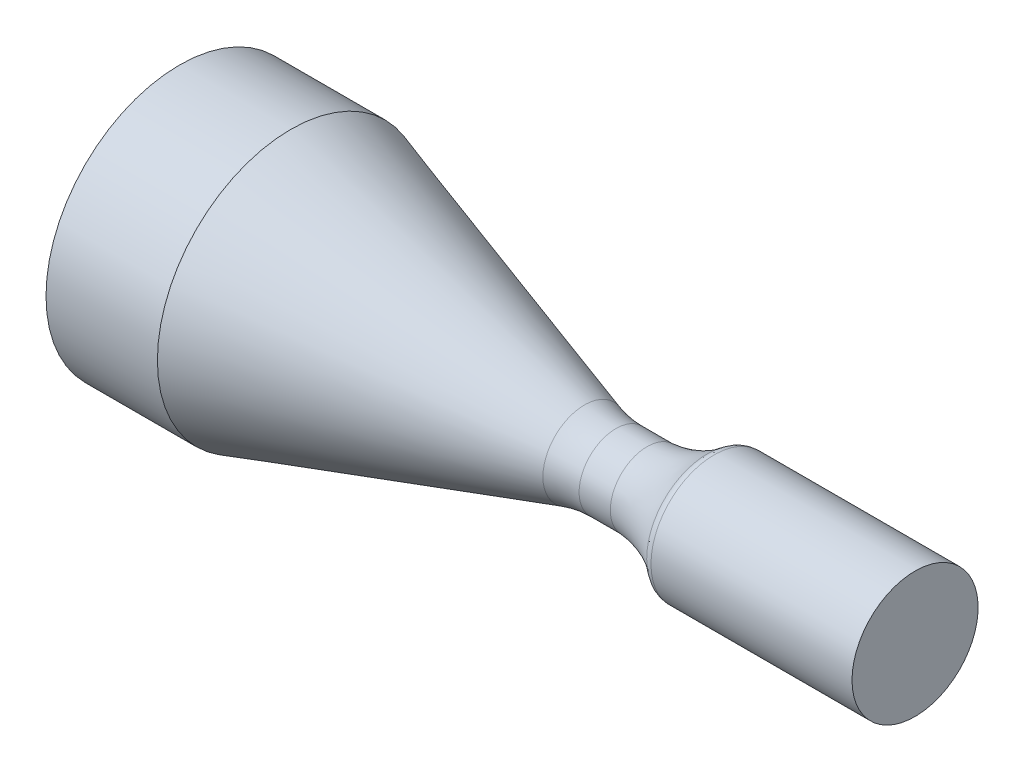
ISO-10303-21;
HEADER;
FILE_DESCRIPTION(('STEP AP214'),'2;1');
FILE_NAME('part.step','',(''),(''),'','','');
FILE_SCHEMA(('AUTOMOTIVE_DESIGN { 1 0 10303 214 1 1 1 1 }'));
ENDSEC;
DATA;
#1=APPLICATION_CONTEXT('core data for automotive mechanical design processes');
#2=APPLICATION_PROTOCOL_DEFINITION('international standard','automotive_design',2000,#1);
#3=PRODUCT_CONTEXT('',#1,'mechanical');
#4=PRODUCT('Part','Part','',(#3));
#5=PRODUCT_RELATED_PRODUCT_CATEGORY('part','',(#4));
#6=PRODUCT_DEFINITION_FORMATION('','',#4);
#7=PRODUCT_DEFINITION_CONTEXT('part definition',#1,'design');
#8=PRODUCT_DEFINITION('design','',#6,#7);
#9=PRODUCT_DEFINITION_SHAPE('','',#8);
#10=(LENGTH_UNIT() NAMED_UNIT(*) SI_UNIT(.MILLI.,.METRE.));
#11=(NAMED_UNIT(*) PLANE_ANGLE_UNIT() SI_UNIT($,.RADIAN.));
#12=(NAMED_UNIT(*) SI_UNIT($,.STERADIAN.) SOLID_ANGLE_UNIT());
#13=UNCERTAINTY_MEASURE_WITH_UNIT(LENGTH_MEASURE(1.E-05),#10,'distance_accuracy_value','');
#14=(GEOMETRIC_REPRESENTATION_CONTEXT(3) GLOBAL_UNCERTAINTY_ASSIGNED_CONTEXT((#13)) GLOBAL_UNIT_ASSIGNED_CONTEXT((#10,
#11,#12)) REPRESENTATION_CONTEXT('',''));
#15=CARTESIAN_POINT('',(0.,0.,0.));
#16=DIRECTION('',(0.,0.,1.));
#17=DIRECTION('',(1.,0.,0.));
#18=AXIS2_PLACEMENT_3D('',#15,#16,#17);
#19=CARTESIAN_POINT('',(200.,0.,0.));
#20=DIRECTION('',(1.,0.,0.));
#21=DIRECTION('',(0.,0.,-1.));
#22=AXIS2_PLACEMENT_3D('',#19,#20,#21);
#23=PLANE('',#22);
#24=CARTESIAN_POINT('',(200.,0.,0.));
#25=DIRECTION('',(-1.,0.,0.));
#26=DIRECTION('',(0.,0.,1.));
#27=AXIS2_PLACEMENT_3D('',#24,#25,#26);
#28=CIRCLE('',#27,127.);
#29=CARTESIAN_POINT('',(200.,0.,127.));
#30=VERTEX_POINT('',#29);
#31=EDGE_CURVE('E10',#30,#30,#28,.T.);
#32=ORIENTED_EDGE('',*,*,#31,.T.);
#33=EDGE_LOOP('',(#32));
#34=FACE_BOUND('',#33,.T.);
#35=ADVANCED_FACE('F32',(#34),#23,.F.);
#36=CARTESIAN_POINT('',(0.,0.,0.));
#37=DIRECTION('',(-1.,0.,0.));
#38=DIRECTION('',(0.,0.,1.));
#39=AXIS2_PLACEMENT_3D('',#36,#37,#38);
#40=CYLINDRICAL_SURFACE('',#39,127.);
#41=ORIENTED_EDGE('',*,*,#31,.F.);
#42=EDGE_LOOP('',(#41));
#43=FACE_BOUND('',#42,.T.);
#44=CARTESIAN_POINT('',(306.,0.,0.));
#45=DIRECTION('',(-1.,0.,0.));
#46=DIRECTION('',(0.,0.,1.));
#47=AXIS2_PLACEMENT_3D('',#44,#45,#46);
#48=CIRCLE('',#47,127.);
#49=CARTESIAN_POINT('',(306.,0.,127.));
#50=VERTEX_POINT('',#49);
#51=EDGE_CURVE('E38',#50,#50,#48,.T.);
#52=ORIENTED_EDGE('',*,*,#51,.T.);
#53=EDGE_LOOP('',(#52));
#54=FACE_BOUND('',#53,.T.);
#55=ADVANCED_FACE('F76',(#43,#54),#40,.T.);
#56=CARTESIAN_POINT('',(585.416444946528,0.,0.));
#57=DIRECTION('',(-1.,0.,0.));
#58=DIRECTION('',(0.,0.,1.));
#59=AXIS2_PLACEMENT_3D('',#56,#57,#58);
#60=CONICAL_SURFACE('',#59,39.5635614453042,0.303272165024855);
#61=CARTESIAN_POINT('',(585.416444946528,0.,0.));
#62=DIRECTION('',(-1.,0.,0.));
#63=DIRECTION('',(0.,0.,1.));
#64=AXIS2_PLACEMENT_3D('',#61,#62,#63);
#65=CIRCLE('',#64,39.5635614453042);
#66=CARTESIAN_POINT('',(585.416444946528,0.,39.5635614453042));
#67=VERTEX_POINT('',#66);
#68=EDGE_CURVE('E42',#67,#67,#65,.T.);
#69=CARTESIAN_POINT('',(306.,0.,127.));
#70=CARTESIAN_POINT('',(308.910587968193,0.,126.089203765055));
#71=CARTESIAN_POINT('',(311.821175936386,0.,125.17840753011));
#72=CARTESIAN_POINT('',(317.642351872772,0.,123.356815060221));
#73=CARTESIAN_POINT('',(320.552939840965,0.,122.446018825276));
#74=CARTESIAN_POINT('',(326.374115777351,0.,120.624426355387));
#75=CARTESIAN_POINT('',(329.284703745544,0.,119.713630120442));
#76=CARTESIAN_POINT('',(335.10587968193,0.,117.892037650553));
#77=CARTESIAN_POINT('',(338.016467650123,0.,116.981241415608));
#78=CARTESIAN_POINT('',(343.837643586509,0.,115.159648945718));
#79=CARTESIAN_POINT('',(346.748231554702,0.,114.248852710774));
#80=CARTESIAN_POINT('',(352.569407491088,0.,112.427260240884));
#81=CARTESIAN_POINT('',(355.479995459281,0.,111.516464005939));
#82=CARTESIAN_POINT('',(361.301171395667,0.,109.69487153605));
#83=CARTESIAN_POINT('',(364.21175936386,0.,108.784075301105));
#84=CARTESIAN_POINT('',(370.032935300246,0.,106.962482831216));
#85=CARTESIAN_POINT('',(372.943523268439,0.,106.051686596271));
#86=CARTESIAN_POINT('',(378.764699204825,0.,104.230094126381));
#87=CARTESIAN_POINT('',(381.675287173018,0.,103.319297891437));
#88=CARTESIAN_POINT('',(387.496463109404,0.,101.497705421547));
#89=CARTESIAN_POINT('',(390.407051077597,0.,100.586909186602));
#90=CARTESIAN_POINT('',(396.228227013983,0.,98.7653167167128));
#91=CARTESIAN_POINT('',(399.138814982176,0.,97.854520481768));
#92=CARTESIAN_POINT('',(404.959990918562,0.,96.0329280118785));
#93=CARTESIAN_POINT('',(407.870578886755,0.,95.1221317769338));
#94=CARTESIAN_POINT('',(413.691754823141,0.,93.3005393070443));
#95=CARTESIAN_POINT('',(416.602342791334,0.,92.3897430720996));
#96=CARTESIAN_POINT('',(422.42351872772,0.,90.5681506022101));
#97=CARTESIAN_POINT('',(425.334106695913,0.,89.6573543672653));
#98=CARTESIAN_POINT('',(431.155282632299,0.,87.8357618973758));
#99=CARTESIAN_POINT('',(434.065870600492,0.,86.9249656624311));
#100=CARTESIAN_POINT('',(439.887046536878,0.,85.1033731925416));
#101=CARTESIAN_POINT('',(442.797634505071,0.,84.1925769575968));
#102=CARTESIAN_POINT('',(448.618810441457,0.,82.3709844877073));
#103=CARTESIAN_POINT('',(451.52939840965,0.,81.4601882527626));
#104=CARTESIAN_POINT('',(457.350574346036,0.,79.6385957828731));
#105=CARTESIAN_POINT('',(460.261162314229,0.,78.7277995479283));
#106=CARTESIAN_POINT('',(466.082338250615,0.,76.9062070780388));
#107=CARTESIAN_POINT('',(468.992926218808,0.,75.9954108430941));
#108=CARTESIAN_POINT('',(474.814102155194,0.,74.1738183732046));
#109=CARTESIAN_POINT('',(477.724690123387,0.,73.2630221382599));
#110=CARTESIAN_POINT('',(483.545866059773,0.,71.4414296683704));
#111=CARTESIAN_POINT('',(486.456454027966,0.,70.5306334334256));
#112=CARTESIAN_POINT('',(492.277629964352,0.,68.7090409635361));
#113=CARTESIAN_POINT('',(495.188217932545,0.,67.7982447285914));
#114=CARTESIAN_POINT('',(501.009393868931,0.,65.9766522587019));
#115=CARTESIAN_POINT('',(503.919981837124,0.,65.0658560237571));
#116=CARTESIAN_POINT('',(509.74115777351,0.,63.2442635538676));
#117=CARTESIAN_POINT('',(512.651745741703,0.,62.3334673189229));
#118=CARTESIAN_POINT('',(518.472921678089,0.,60.5118748490334));
#119=CARTESIAN_POINT('',(521.383509646282,0.,59.6010786140886));
#120=CARTESIAN_POINT('',(527.204685582668,0.,57.7794861441991));
#121=CARTESIAN_POINT('',(530.115273550861,0.,56.8686899092544));
#122=CARTESIAN_POINT('',(535.936449487247,0.,55.0470974393649));
#123=CARTESIAN_POINT('',(538.84703745544,0.,54.1363012044202));
#124=CARTESIAN_POINT('',(544.668213391826,0.,52.3147087345307));
#125=CARTESIAN_POINT('',(547.578801360019,0.,51.4039124995859));
#126=CARTESIAN_POINT('',(553.399977296405,0.,49.5823200296964));
#127=CARTESIAN_POINT('',(556.310565264598,0.,48.6715237947517));
#128=CARTESIAN_POINT('',(562.131741200984,0.,46.8499313248622));
#129=CARTESIAN_POINT('',(565.042329169177,0.,45.9391350899174));
#130=CARTESIAN_POINT('',(570.863505105563,0.,44.1175426200279));
#131=CARTESIAN_POINT('',(573.774093073756,0.,43.2067463850832));
#132=CARTESIAN_POINT('',(579.595269010142,0.,41.3851539151937));
#133=CARTESIAN_POINT('',(582.505856978335,0.,40.4743576802489));
#134=CARTESIAN_POINT('',(585.416444946528,0.,39.5635614453042));
#135=B_SPLINE_CURVE_WITH_KNOTS('',3,(#69,#70,#71,#72,#73,#74,#75,#76,#77,#78,#79,#80,#81,#82,
#83,#84,#85,#86,#87,#88,#89,#90,#91,#92,#93,#94,#95,#96,#97,#98,#99,#100,#101,#102,#103,#104,
#105,#106,#107,#108,#109,#110,#111,#112,#113,#114,#115,#116,#117,#118,#119,#120,#121,#122,#123,
#124,#125,#126,#127,#128,#129,#130,#131,#132,#133,#134),.UNSPECIFIED.,.F.,.F.,(4,2,2,2,2,2,2,2,
2,2,2,2,2,2,2,2,2,2,2,2,2,2,2,2,2,2,2,2,2,2,2,2,4),(0.,9.14929772822012,18.2985954564403,
27.4478931846604,36.5971909128806,45.7464886411007,54.8957863693209,64.045084097541,
73.1943818257612,82.3436795539813,91.4929772822015,100.642275010422,109.791572738642,
118.940870466862,128.090168195082,137.239465923302,146.388763651522,155.538061379742,
164.687359107963,173.836656836183,182.985954564403,192.135252292623,201.284550020843,
210.433847749063,219.583145477284,228.732443205504,237.881740933724,247.031038661944,
256.180336390164,265.329634118384,274.478931846604,283.628229574825,292.777527303045),.UNSPECIFIED.);
#136=EDGE_CURVE('BSEAM80',#50,#67,#135,.T.);
#137=ORIENTED_EDGE('',*,*,#51,.F.);
#138=ORIENTED_EDGE('',*,*,#68,.T.);
#139=ORIENTED_EDGE('',*,*,#136,.T.);
#140=ORIENTED_EDGE('',*,*,#136,.F.);
#141=EDGE_LOOP('',(#137,#139,#138,#140));
#142=FACE_BOUND('',#141,.T.);
#143=ADVANCED_FACE('F80',(#142),#60,.T.);
#144=CARTESIAN_POINT('',(615.280908711943,0.,0.));
#145=DIRECTION('',(-1.,0.,0.));
#146=DIRECTION('',(0.,0.,1.));
#147=AXIS2_PLACEMENT_3D('',#144,#145,#146);
#148=TOROIDAL_SURFACE('',#147,135.,100.);
#149=ORIENTED_EDGE('',*,*,#68,.F.);
#150=EDGE_LOOP('',(#149));
#151=FACE_BOUND('',#150,.T.);
#152=CARTESIAN_POINT('',(615.280908711943,0.,0.));
#153=DIRECTION('',(-1.,0.,0.));
#154=DIRECTION('',(0.,0.,1.));
#155=AXIS2_PLACEMENT_3D('',#152,#153,#154);
#156=CIRCLE('',#155,35.);
#157=CARTESIAN_POINT('',(615.280908711943,0.,35.));
#158=VERTEX_POINT('',#157);
#159=EDGE_CURVE('E46',#158,#158,#156,.T.);
#160=ORIENTED_EDGE('',*,*,#159,.T.);
#161=EDGE_LOOP('',(#160));
#162=FACE_BOUND('',#161,.T.);
#163=ADVANCED_FACE('F85',(#151,#162),#148,.F.);
#164=CARTESIAN_POINT('',(0.,0.,0.));
#165=DIRECTION('',(-1.,0.,0.));
#166=DIRECTION('',(0.,0.,1.));
#167=AXIS2_PLACEMENT_3D('',#164,#165,#166);
#168=CYLINDRICAL_SURFACE('',#167,35.);
#169=ORIENTED_EDGE('',*,*,#159,.F.);
#170=EDGE_LOOP('',(#169));
#171=FACE_BOUND('',#170,.T.);
#172=CARTESIAN_POINT('',(645.,0.,0.));
#173=DIRECTION('',(-1.,0.,0.));
#174=DIRECTION('',(0.,0.,1.));
#175=AXIS2_PLACEMENT_3D('',#172,#173,#174);
#176=CIRCLE('',#175,35.);
#177=CARTESIAN_POINT('',(645.,0.,35.));
#178=VERTEX_POINT('',#177);
#179=EDGE_CURVE('E51',#178,#178,#176,.T.);
#180=ORIENTED_EDGE('',*,*,#179,.T.);
#181=EDGE_LOOP('',(#180));
#182=FACE_BOUND('',#181,.T.);
#183=ADVANCED_FACE('F91',(#171,#182),#168,.T.);
#184=CARTESIAN_POINT('',(638.626384001197,0.,0.));
#185=DIRECTION('',(-1.,0.,0.));
#186=DIRECTION('',(0.,0.,1.));
#187=AXIS2_PLACEMENT_3D('',#184,#185,#186);
#188=TOROIDAL_SURFACE('',#187,134.796678397128,99.9999999999999);
#189=ORIENTED_EDGE('',*,*,#179,.F.);
#190=EDGE_LOOP('',(#189));
#191=FACE_BOUND('',#190,.T.);
#192=CARTESIAN_POINT('',(702.324557443191,0.,0.));
#193=DIRECTION('',(-1.,0.,0.));
#194=DIRECTION('',(0.,0.,1.));
#195=AXIS2_PLACEMENT_3D('',#192,#193,#194);
#196=CIRCLE('',#195,57.7087889451934);
#197=CARTESIAN_POINT('',(702.324557443191,0.,57.7087889451934));
#198=VERTEX_POINT('',#197);
#199=EDGE_CURVE('E54',#198,#198,#196,.T.);
#200=ORIENTED_EDGE('',*,*,#199,.T.);
#201=EDGE_LOOP('',(#200));
#202=FACE_BOUND('',#201,.T.);
#203=ADVANCED_FACE('F95',(#191,#202),#188,.F.);
#204=CARTESIAN_POINT('',(708.69437478739,0.,0.));
#205=DIRECTION('',(-1.,0.,0.));
#206=DIRECTION('',(0.,0.,1.));
#207=AXIS2_PLACEMENT_3D('',#204,#205,#206);
#208=TOROIDAL_SURFACE('',#207,50.,9.99999999999999);
#209=ORIENTED_EDGE('',*,*,#199,.F.);
#210=EDGE_LOOP('',(#209));
#211=FACE_BOUND('',#210,.T.);
#212=CARTESIAN_POINT('',(708.69437478739,0.,0.));
#213=DIRECTION('',(-1.,0.,0.));
#214=DIRECTION('',(0.,0.,1.));
#215=AXIS2_PLACEMENT_3D('',#212,#213,#214);
#216=CIRCLE('',#215,60.);
#217=CARTESIAN_POINT('',(708.69437478739,0.,60.));
#218=VERTEX_POINT('',#217);
#219=EDGE_CURVE('E57',#218,#218,#216,.T.);
#220=ORIENTED_EDGE('',*,*,#219,.T.);
#221=EDGE_LOOP('',(#220));
#222=FACE_BOUND('',#221,.T.);
#223=ADVANCED_FACE('F72',(#211,#222),#208,.T.);
#224=CARTESIAN_POINT('',(0.,0.,0.));
#225=DIRECTION('',(-1.,0.,0.));
#226=DIRECTION('',(0.,0.,1.));
#227=AXIS2_PLACEMENT_3D('',#224,#225,#226);
#228=CYLINDRICAL_SURFACE('',#227,60.);
#229=ORIENTED_EDGE('',*,*,#219,.F.);
#230=EDGE_LOOP('',(#229));
#231=FACE_BOUND('',#230,.T.);
#232=CARTESIAN_POINT('',(900.,0.,0.));
#233=DIRECTION('',(-1.,0.,0.));
#234=DIRECTION('',(0.,0.,1.));
#235=AXIS2_PLACEMENT_3D('',#232,#233,#234);
#236=CIRCLE('',#235,60.);
#237=CARTESIAN_POINT('',(900.,0.,60.));
#238=VERTEX_POINT('',#237);
#239=EDGE_CURVE('E60',#238,#238,#236,.T.);
#240=ORIENTED_EDGE('',*,*,#239,.T.);
#241=EDGE_LOOP('',(#240));
#242=FACE_BOUND('',#241,.T.);
#243=ADVANCED_FACE('F64',(#231,#242),#228,.T.);
#244=CARTESIAN_POINT('',(900.,0.,-60.));
#245=DIRECTION('',(-1.,0.,0.));
#246=DIRECTION('',(0.,0.,1.));
#247=AXIS2_PLACEMENT_3D('',#244,#245,#246);
#248=PLANE('',#247);
#249=ORIENTED_EDGE('',*,*,#239,.F.);
#250=EDGE_LOOP('',(#249));
#251=FACE_BOUND('',#250,.T.);
#252=ADVANCED_FACE('F66',(#251),#248,.F.);
#253=CLOSED_SHELL('',(#35,#55,#143,#163,#183,#203,#223,#243,#252));
#254=MANIFOLD_SOLID_BREP('B2',#253);
#255=ADVANCED_BREP_SHAPE_REPRESENTATION('',(#18,#254),#14);
#256=SHAPE_DEFINITION_REPRESENTATION(#9,#255);
ENDSEC;
END-ISO-10303-21;
